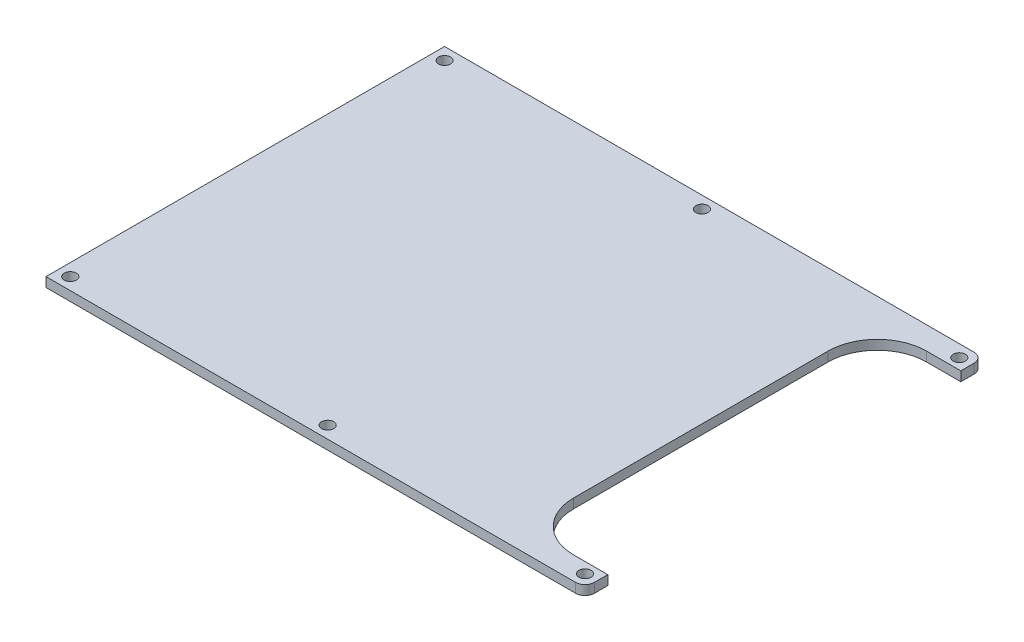
ISO-10303-21;
HEADER;
FILE_DESCRIPTION(('STEP AP214'),'2;1');
FILE_NAME('part.step','',(''),(''),'','','');
FILE_SCHEMA(('AUTOMOTIVE_DESIGN { 1 0 10303 214 1 1 1 1 }'));
ENDSEC;
DATA;
#1=APPLICATION_CONTEXT('core data for automotive mechanical design processes');
#2=APPLICATION_PROTOCOL_DEFINITION('international standard','automotive_design',2000,#1);
#3=PRODUCT_CONTEXT('',#1,'mechanical');
#4=PRODUCT('Part','Part','',(#3));
#5=PRODUCT_RELATED_PRODUCT_CATEGORY('part','',(#4));
#6=PRODUCT_DEFINITION_FORMATION('','',#4);
#7=PRODUCT_DEFINITION_CONTEXT('part definition',#1,'design');
#8=PRODUCT_DEFINITION('design','',#6,#7);
#9=PRODUCT_DEFINITION_SHAPE('','',#8);
#10=(LENGTH_UNIT() NAMED_UNIT(*) SI_UNIT(.MILLI.,.METRE.));
#11=(NAMED_UNIT(*) PLANE_ANGLE_UNIT() SI_UNIT($,.RADIAN.));
#12=(NAMED_UNIT(*) SI_UNIT($,.STERADIAN.) SOLID_ANGLE_UNIT());
#13=UNCERTAINTY_MEASURE_WITH_UNIT(LENGTH_MEASURE(1.E-05),#10,'distance_accuracy_value','');
#14=(GEOMETRIC_REPRESENTATION_CONTEXT(3) GLOBAL_UNCERTAINTY_ASSIGNED_CONTEXT((#13)) GLOBAL_UNIT_ASSIGNED_CONTEXT((#10,
#11,#12)) REPRESENTATION_CONTEXT('',''));
#15=CARTESIAN_POINT('',(0.,0.,0.));
#16=DIRECTION('',(0.,0.,1.));
#17=DIRECTION('',(1.,0.,0.));
#18=AXIS2_PLACEMENT_3D('',#15,#16,#17);
#19=CARTESIAN_POINT('',(71.,2.5,52.5));
#20=DIRECTION('',(-1.,0.,0.));
#21=DIRECTION('',(0.,0.,1.));
#22=AXIS2_PLACEMENT_3D('',#19,#20,#21);
#23=PLANE('',#22);
#24=DIRECTION('',(0.,0.,-1.));
#25=VECTOR('',#24,1.);
#26=CARTESIAN_POINT('',(71.,2.5,52.5));
#27=LINE('',#26,#25);
#28=CARTESIAN_POINT('',(71.,2.5,50.));
#29=VERTEX_POINT('',#28);
#30=CARTESIAN_POINT('',(71.,2.5,46.5));
#31=VERTEX_POINT('',#30);
#32=EDGE_CURVE('E184',#29,#31,#27,.T.);
#33=ORIENTED_EDGE('',*,*,#32,.F.);
#34=DIRECTION('',(0.,-1.,0.));
#35=VECTOR('',#34,1.);
#36=CARTESIAN_POINT('',(71.,2.5,50.));
#37=LINE('',#36,#35);
#38=CARTESIAN_POINT('',(71.,0.,50.));
#39=VERTEX_POINT('',#38);
#40=EDGE_CURVE('E41',#29,#39,#37,.T.);
#41=ORIENTED_EDGE('',*,*,#40,.T.);
#42=DIRECTION('',(0.,0.,-1.));
#43=VECTOR('',#42,1.);
#44=CARTESIAN_POINT('',(71.,0.,52.5));
#45=LINE('',#44,#43);
#46=CARTESIAN_POINT('',(71.,0.,46.5));
#47=VERTEX_POINT('',#46);
#48=EDGE_CURVE('E123',#39,#47,#45,.T.);
#49=ORIENTED_EDGE('',*,*,#48,.T.);
#50=DIRECTION('',(0.,1.,0.));
#51=VECTOR('',#50,1.);
#52=CARTESIAN_POINT('',(71.,-0.00100000000000013,46.5));
#53=LINE('',#52,#51);
#54=EDGE_CURVE('E126',#47,#31,#53,.T.);
#55=ORIENTED_EDGE('',*,*,#54,.T.);
#56=EDGE_LOOP('',(#33,#41,#49,#55));
#57=FACE_BOUND('',#56,.T.);
#58=ADVANCED_FACE('F33',(#57),#23,.F.);
#59=CARTESIAN_POINT('',(71.,0.,-46.5));
#60=VERTEX_POINT('',#59);
#61=CARTESIAN_POINT('',(71.,0.,-50.));
#62=VERTEX_POINT('',#61);
#63=EDGE_CURVE('E130',#60,#62,#45,.T.);
#64=ORIENTED_EDGE('',*,*,#63,.T.);
#65=DIRECTION('',(0.,-1.,0.));
#66=VECTOR('',#65,1.);
#67=CARTESIAN_POINT('',(71.,2.5,-50.));
#68=LINE('',#67,#66);
#69=CARTESIAN_POINT('',(71.,2.5,-50.));
#70=VERTEX_POINT('',#69);
#71=EDGE_CURVE('E227',#62,#70,#68,.F.);
#72=ORIENTED_EDGE('',*,*,#71,.T.);
#73=CARTESIAN_POINT('',(71.,2.5,-46.5));
#74=VERTEX_POINT('',#73);
#75=EDGE_CURVE('E187',#74,#70,#27,.T.);
#76=ORIENTED_EDGE('',*,*,#75,.F.);
#77=DIRECTION('',(0.,1.,0.));
#78=VECTOR('',#77,1.);
#79=CARTESIAN_POINT('',(71.,-0.00100000000000013,-46.5));
#80=LINE('',#79,#78);
#81=EDGE_CURVE('E151',#60,#74,#80,.T.);
#82=ORIENTED_EDGE('',*,*,#81,.F.);
#83=EDGE_LOOP('',(#64,#72,#76,#82));
#84=FACE_BOUND('',#83,.T.);
#85=ADVANCED_FACE('F250',(#84),#23,.F.);
#86=CARTESIAN_POINT('',(-71.,2.5,-52.5));
#87=DIRECTION('',(0.,0.,1.));
#88=DIRECTION('',(1.,0.,0.));
#89=AXIS2_PLACEMENT_3D('',#86,#87,#88);
#90=PLANE('',#89);
#91=DIRECTION('',(-1.,0.,0.));
#92=VECTOR('',#91,1.);
#93=CARTESIAN_POINT('',(-71.,2.5,-52.5));
#94=LINE('',#93,#92);
#95=CARTESIAN_POINT('',(68.5,2.5,-52.5));
#96=VERTEX_POINT('',#95);
#97=CARTESIAN_POINT('',(-71.,2.5,-52.5));
#98=VERTEX_POINT('',#97);
#99=EDGE_CURVE('E186',#96,#98,#94,.T.);
#100=ORIENTED_EDGE('',*,*,#99,.F.);
#101=DIRECTION('',(0.,-1.,0.));
#102=VECTOR('',#101,1.);
#103=CARTESIAN_POINT('',(68.5,2.5,-52.5));
#104=LINE('',#103,#102);
#105=CARTESIAN_POINT('',(68.5,0.,-52.5));
#106=VERTEX_POINT('',#105);
#107=EDGE_CURVE('E220',#96,#106,#104,.T.);
#108=ORIENTED_EDGE('',*,*,#107,.T.);
#109=DIRECTION('',(-1.,0.,0.));
#110=VECTOR('',#109,1.);
#111=CARTESIAN_POINT('',(-71.,0.,-52.5));
#112=LINE('',#111,#110);
#113=CARTESIAN_POINT('',(-71.,0.,-52.5));
#114=VERTEX_POINT('',#113);
#115=EDGE_CURVE('E129',#106,#114,#112,.T.);
#116=ORIENTED_EDGE('',*,*,#115,.T.);
#117=DIRECTION('',(0.,-1.,0.));
#118=VECTOR('',#117,1.);
#119=CARTESIAN_POINT('',(-71.,2.5,-52.5));
#120=LINE('',#119,#118);
#121=EDGE_CURVE('E201',#98,#114,#120,.T.);
#122=ORIENTED_EDGE('',*,*,#121,.F.);
#123=EDGE_LOOP('',(#100,#108,#116,#122));
#124=FACE_BOUND('',#123,.T.);
#125=ADVANCED_FACE('F242',(#124),#90,.F.);
#126=CARTESIAN_POINT('',(-71.,2.5,52.5));
#127=DIRECTION('',(1.,0.,0.));
#128=DIRECTION('',(0.,0.,-1.));
#129=AXIS2_PLACEMENT_3D('',#126,#127,#128);
#130=PLANE('',#129);
#131=DIRECTION('',(0.,0.,1.));
#132=VECTOR('',#131,1.);
#133=CARTESIAN_POINT('',(-71.,0.,52.5));
#134=LINE('',#133,#132);
#135=CARTESIAN_POINT('',(-71.,0.,52.5));
#136=VERTEX_POINT('',#135);
#137=EDGE_CURVE('E195',#114,#136,#134,.T.);
#138=ORIENTED_EDGE('',*,*,#137,.T.);
#139=DIRECTION('',(0.,-1.,0.));
#140=VECTOR('',#139,1.);
#141=CARTESIAN_POINT('',(-71.,2.5,52.5));
#142=LINE('',#141,#140);
#143=CARTESIAN_POINT('',(-71.,2.5,52.5));
#144=VERTEX_POINT('',#143);
#145=EDGE_CURVE('E192',#144,#136,#142,.T.);
#146=ORIENTED_EDGE('',*,*,#145,.F.);
#147=DIRECTION('',(0.,0.,1.));
#148=VECTOR('',#147,1.);
#149=CARTESIAN_POINT('',(-71.,2.5,52.5));
#150=LINE('',#149,#148);
#151=EDGE_CURVE('E189',#98,#144,#150,.T.);
#152=ORIENTED_EDGE('',*,*,#151,.F.);
#153=ORIENTED_EDGE('',*,*,#121,.T.);
#154=EDGE_LOOP('',(#138,#146,#152,#153));
#155=FACE_BOUND('',#154,.T.);
#156=ADVANCED_FACE('F323',(#155),#130,.F.);
#157=CARTESIAN_POINT('',(-71.,2.5,52.5));
#158=DIRECTION('',(0.,0.,-1.));
#159=DIRECTION('',(-1.,0.,0.));
#160=AXIS2_PLACEMENT_3D('',#157,#158,#159);
#161=PLANE('',#160);
#162=DIRECTION('',(1.,0.,0.));
#163=VECTOR('',#162,1.);
#164=CARTESIAN_POINT('',(-71.,0.,52.5));
#165=LINE('',#164,#163);
#166=CARTESIAN_POINT('',(68.5,0.,52.5));
#167=VERTEX_POINT('',#166);
#168=EDGE_CURVE('E197',#136,#167,#165,.T.);
#169=ORIENTED_EDGE('',*,*,#168,.T.);
#170=DIRECTION('',(0.,-1.,0.));
#171=VECTOR('',#170,1.);
#172=CARTESIAN_POINT('',(68.5,2.5,52.5));
#173=LINE('',#172,#171);
#174=CARTESIAN_POINT('',(68.5,2.5,52.5));
#175=VERTEX_POINT('',#174);
#176=EDGE_CURVE('E11',#167,#175,#173,.F.);
#177=ORIENTED_EDGE('',*,*,#176,.T.);
#178=DIRECTION('',(1.,0.,0.));
#179=VECTOR('',#178,1.);
#180=CARTESIAN_POINT('',(-71.,2.5,52.5));
#181=LINE('',#180,#179);
#182=EDGE_CURVE('E191',#144,#175,#181,.T.);
#183=ORIENTED_EDGE('',*,*,#182,.F.);
#184=ORIENTED_EDGE('',*,*,#145,.T.);
#185=EDGE_LOOP('',(#169,#177,#183,#184));
#186=FACE_BOUND('',#185,.T.);
#187=ADVANCED_FACE('F277',(#186),#161,.F.);
#188=CARTESIAN_POINT('',(0.,2.5,0.));
#189=DIRECTION('',(0.,-1.,0.));
#190=DIRECTION('',(0.,0.,-1.));
#191=AXIS2_PLACEMENT_3D('',#188,#189,#190);
#192=PLANE('',#191);
#193=CARTESIAN_POINT('',(0.,2.5,-49.3));
#194=DIRECTION('',(0.,1.,0.));
#195=DIRECTION('',(0.,0.,1.));
#196=AXIS2_PLACEMENT_3D('',#193,#194,#195);
#197=CIRCLE('',#196,1.6);
#198=CARTESIAN_POINT('',(0.,2.5,-47.7));
#199=VERTEX_POINT('',#198);
#200=EDGE_CURVE('E160',#199,#199,#197,.T.);
#201=ORIENTED_EDGE('',*,*,#200,.F.);
#202=EDGE_LOOP('',(#201));
#203=FACE_BOUND('',#202,.T.);
#204=CARTESIAN_POINT('',(0.,2.5,49.3));
#205=DIRECTION('',(0.,1.,0.));
#206=DIRECTION('',(0.,0.,1.));
#207=AXIS2_PLACEMENT_3D('',#204,#205,#206);
#208=CIRCLE('',#207,1.6);
#209=CARTESIAN_POINT('',(0.,2.5,50.9));
#210=VERTEX_POINT('',#209);
#211=EDGE_CURVE('E166',#210,#210,#208,.T.);
#212=ORIENTED_EDGE('',*,*,#211,.F.);
#213=EDGE_LOOP('',(#212));
#214=FACE_BOUND('',#213,.T.);
#215=CARTESIAN_POINT('',(-67.8,2.5,49.3));
#216=DIRECTION('',(0.,1.,0.));
#217=DIRECTION('',(0.,0.,1.));
#218=AXIS2_PLACEMENT_3D('',#215,#216,#217);
#219=CIRCLE('',#218,1.60000000000001);
#220=CARTESIAN_POINT('',(-67.8,2.5,50.9));
#221=VERTEX_POINT('',#220);
#222=EDGE_CURVE('E172',#221,#221,#219,.T.);
#223=ORIENTED_EDGE('',*,*,#222,.F.);
#224=EDGE_LOOP('',(#223));
#225=FACE_BOUND('',#224,.T.);
#226=CARTESIAN_POINT('',(67.8,2.5,-49.3));
#227=DIRECTION('',(0.,1.,0.));
#228=DIRECTION('',(0.,0.,1.));
#229=AXIS2_PLACEMENT_3D('',#226,#227,#228);
#230=CIRCLE('',#229,1.60000000000001);
#231=CARTESIAN_POINT('',(67.8,2.5,-47.7));
#232=VERTEX_POINT('',#231);
#233=EDGE_CURVE('E178',#232,#232,#230,.T.);
#234=ORIENTED_EDGE('',*,*,#233,.F.);
#235=EDGE_LOOP('',(#234));
#236=FACE_BOUND('',#235,.T.);
#237=CARTESIAN_POINT('',(67.8,2.5,49.3));
#238=DIRECTION('',(0.,1.,0.));
#239=DIRECTION('',(0.,0.,1.));
#240=AXIS2_PLACEMENT_3D('',#237,#238,#239);
#241=CIRCLE('',#240,1.60000000000001);
#242=CARTESIAN_POINT('',(67.8,2.5,50.9));
#243=VERTEX_POINT('',#242);
#244=EDGE_CURVE('E264',#243,#243,#241,.T.);
#245=ORIENTED_EDGE('',*,*,#244,.F.);
#246=EDGE_LOOP('',(#245));
#247=FACE_BOUND('',#246,.T.);
#248=CARTESIAN_POINT('',(-67.8,2.5,-49.3));
#249=DIRECTION('',(0.,1.,0.));
#250=DIRECTION('',(0.,0.,1.));
#251=AXIS2_PLACEMENT_3D('',#248,#249,#250);
#252=CIRCLE('',#251,1.60000000000001);
#253=CARTESIAN_POINT('',(-67.8,2.5,-47.7));
#254=VERTEX_POINT('',#253);
#255=EDGE_CURVE('E179',#254,#254,#252,.T.);
#256=ORIENTED_EDGE('',*,*,#255,.F.);
#257=EDGE_LOOP('',(#256));
#258=FACE_BOUND('',#257,.T.);
#259=ORIENTED_EDGE('',*,*,#75,.T.);
#260=CARTESIAN_POINT('',(68.5,2.5,-50.));
#261=DIRECTION('',(0.,-1.,0.));
#262=DIRECTION('',(0.,0.,-1.));
#263=AXIS2_PLACEMENT_3D('',#260,#261,#262);
#264=CIRCLE('',#263,2.5);
#265=EDGE_CURVE('E230',#70,#96,#264,.F.);
#266=ORIENTED_EDGE('',*,*,#265,.T.);
#267=ORIENTED_EDGE('',*,*,#99,.T.);
#268=ORIENTED_EDGE('',*,*,#151,.T.);
#269=ORIENTED_EDGE('',*,*,#182,.T.);
#270=CARTESIAN_POINT('',(68.5,2.5,50.));
#271=DIRECTION('',(0.,-1.,0.));
#272=DIRECTION('',(0.,0.,-1.));
#273=AXIS2_PLACEMENT_3D('',#270,#271,#272);
#274=CIRCLE('',#273,2.5);
#275=EDGE_CURVE('E53',#175,#29,#274,.F.);
#276=ORIENTED_EDGE('',*,*,#275,.T.);
#277=ORIENTED_EDGE('',*,*,#32,.T.);
#278=DIRECTION('',(1.,0.,0.));
#279=VECTOR('',#278,1.);
#280=CARTESIAN_POINT('',(71.,2.5,46.5));
#281=LINE('',#280,#279);
#282=CARTESIAN_POINT('',(62.,2.5,46.5));
#283=VERTEX_POINT('',#282);
#284=EDGE_CURVE('E149',#283,#31,#281,.T.);
#285=ORIENTED_EDGE('',*,*,#284,.F.);
#286=CARTESIAN_POINT('',(62.,2.5,33.5));
#287=DIRECTION('',(0.,-1.,0.));
#288=DIRECTION('',(0.,0.,-1.));
#289=AXIS2_PLACEMENT_3D('',#286,#287,#288);
#290=CIRCLE('',#289,13.);
#291=CARTESIAN_POINT('',(49.,2.5,33.5));
#292=VERTEX_POINT('',#291);
#293=EDGE_CURVE('E213',#283,#292,#290,.T.);
#294=ORIENTED_EDGE('',*,*,#293,.T.);
#295=DIRECTION('',(0.,0.,1.));
#296=VECTOR('',#295,1.);
#297=CARTESIAN_POINT('',(49.,2.5,-46.5));
#298=LINE('',#297,#296);
#299=CARTESIAN_POINT('',(49.,2.5,-33.5));
#300=VERTEX_POINT('',#299);
#301=EDGE_CURVE('E256',#300,#292,#298,.T.);
#302=ORIENTED_EDGE('',*,*,#301,.F.);
#303=CARTESIAN_POINT('',(62.,2.5,-33.5));
#304=DIRECTION('',(0.,-1.,0.));
#305=DIRECTION('',(0.,0.,-1.));
#306=AXIS2_PLACEMENT_3D('',#303,#304,#305);
#307=CIRCLE('',#306,13.);
#308=CARTESIAN_POINT('',(62.,2.5,-46.5));
#309=VERTEX_POINT('',#308);
#310=EDGE_CURVE('E216',#300,#309,#307,.T.);
#311=ORIENTED_EDGE('',*,*,#310,.T.);
#312=DIRECTION('',(-1.,0.,0.));
#313=VECTOR('',#312,1.);
#314=CARTESIAN_POINT('',(71.,2.5,-46.5));
#315=LINE('',#314,#313);
#316=EDGE_CURVE('E143',#74,#309,#315,.T.);
#317=ORIENTED_EDGE('',*,*,#316,.F.);
#318=EDGE_LOOP('',(#259,#266,#267,#268,#269,#276,#277,#285,#294,#302,#311,#317));
#319=FACE_BOUND('',#318,.T.);
#320=ADVANCED_FACE('F234',(#203,#214,#225,#236,#247,#258,#319),#192,.F.);
#321=CARTESIAN_POINT('',(0.,0.,0.));
#322=DIRECTION('',(0.,-1.,0.));
#323=DIRECTION('',(0.,0.,-1.));
#324=AXIS2_PLACEMENT_3D('',#321,#322,#323);
#325=PLANE('',#324);
#326=ORIENTED_EDGE('',*,*,#115,.F.);
#327=CARTESIAN_POINT('',(68.5,0.,-50.));
#328=DIRECTION('',(0.,-1.,0.));
#329=DIRECTION('',(0.,0.,-1.));
#330=AXIS2_PLACEMENT_3D('',#327,#328,#329);
#331=CIRCLE('',#330,2.5);
#332=EDGE_CURVE('E225',#106,#62,#331,.T.);
#333=ORIENTED_EDGE('',*,*,#332,.T.);
#334=ORIENTED_EDGE('',*,*,#63,.F.);
#335=DIRECTION('',(-1.,0.,0.));
#336=VECTOR('',#335,1.);
#337=CARTESIAN_POINT('',(71.,0.,-46.5));
#338=LINE('',#337,#336);
#339=CARTESIAN_POINT('',(62.,0.,-46.5));
#340=VERTEX_POINT('',#339);
#341=EDGE_CURVE('E150',#60,#340,#338,.T.);
#342=ORIENTED_EDGE('',*,*,#341,.T.);
#343=CARTESIAN_POINT('',(62.,0.,-33.5));
#344=DIRECTION('',(0.,-1.,0.));
#345=DIRECTION('',(0.,0.,-1.));
#346=AXIS2_PLACEMENT_3D('',#343,#344,#345);
#347=CIRCLE('',#346,13.);
#348=CARTESIAN_POINT('',(49.,0.,-33.5));
#349=VERTEX_POINT('',#348);
#350=EDGE_CURVE('E218',#340,#349,#347,.F.);
#351=ORIENTED_EDGE('',*,*,#350,.T.);
#352=DIRECTION('',(0.,0.,1.));
#353=VECTOR('',#352,1.);
#354=CARTESIAN_POINT('',(49.,0.,-46.5));
#355=LINE('',#354,#353);
#356=CARTESIAN_POINT('',(49.,0.,33.5));
#357=VERTEX_POINT('',#356);
#358=EDGE_CURVE('E144',#349,#357,#355,.T.);
#359=ORIENTED_EDGE('',*,*,#358,.T.);
#360=CARTESIAN_POINT('',(62.,0.,33.5));
#361=DIRECTION('',(0.,-1.,0.));
#362=DIRECTION('',(0.,0.,-1.));
#363=AXIS2_PLACEMENT_3D('',#360,#361,#362);
#364=CIRCLE('',#363,13.);
#365=CARTESIAN_POINT('',(62.,0.,46.5));
#366=VERTEX_POINT('',#365);
#367=EDGE_CURVE('E139',#357,#366,#364,.F.);
#368=ORIENTED_EDGE('',*,*,#367,.T.);
#369=DIRECTION('',(1.,0.,0.));
#370=VECTOR('',#369,1.);
#371=CARTESIAN_POINT('',(71.,0.,46.5));
#372=LINE('',#371,#370);
#373=EDGE_CURVE('E133',#366,#47,#372,.T.);
#374=ORIENTED_EDGE('',*,*,#373,.T.);
#375=ORIENTED_EDGE('',*,*,#48,.F.);
#376=CARTESIAN_POINT('',(68.5,0.,50.));
#377=DIRECTION('',(0.,-1.,0.));
#378=DIRECTION('',(0.,0.,-1.));
#379=AXIS2_PLACEMENT_3D('',#376,#377,#378);
#380=CIRCLE('',#379,2.5);
#381=EDGE_CURVE('E223',#39,#167,#380,.T.);
#382=ORIENTED_EDGE('',*,*,#381,.T.);
#383=ORIENTED_EDGE('',*,*,#168,.F.);
#384=ORIENTED_EDGE('',*,*,#137,.F.);
#385=EDGE_LOOP('',(#326,#333,#334,#342,#351,#359,#368,#374,#375,#382,#383,#384));
#386=FACE_BOUND('',#385,.T.);
#387=CARTESIAN_POINT('',(0.,0.,-49.3));
#388=DIRECTION('',(0.,-1.,0.));
#389=DIRECTION('',(0.,0.,-1.));
#390=AXIS2_PLACEMENT_3D('',#387,#388,#389);
#391=CIRCLE('',#390,1.6);
#392=CARTESIAN_POINT('',(0.,0.,-50.9));
#393=VERTEX_POINT('',#392);
#394=EDGE_CURVE('E163',#393,#393,#391,.F.);
#395=ORIENTED_EDGE('',*,*,#394,.T.);
#396=EDGE_LOOP('',(#395));
#397=FACE_BOUND('',#396,.T.);
#398=CARTESIAN_POINT('',(0.,0.,49.3));
#399=DIRECTION('',(0.,-1.,0.));
#400=DIRECTION('',(0.,0.,-1.));
#401=AXIS2_PLACEMENT_3D('',#398,#399,#400);
#402=CIRCLE('',#401,1.6);
#403=CARTESIAN_POINT('',(0.,0.,47.7));
#404=VERTEX_POINT('',#403);
#405=EDGE_CURVE('E169',#404,#404,#402,.F.);
#406=ORIENTED_EDGE('',*,*,#405,.T.);
#407=EDGE_LOOP('',(#406));
#408=FACE_BOUND('',#407,.T.);
#409=CARTESIAN_POINT('',(-67.8,0.,49.3));
#410=DIRECTION('',(0.,-1.,0.));
#411=DIRECTION('',(0.,0.,-1.));
#412=AXIS2_PLACEMENT_3D('',#409,#410,#411);
#413=CIRCLE('',#412,1.60000000000001);
#414=CARTESIAN_POINT('',(-67.8,0.,47.7));
#415=VERTEX_POINT('',#414);
#416=EDGE_CURVE('E175',#415,#415,#413,.F.);
#417=ORIENTED_EDGE('',*,*,#416,.T.);
#418=EDGE_LOOP('',(#417));
#419=FACE_BOUND('',#418,.T.);
#420=CARTESIAN_POINT('',(67.8,0.,-49.3));
#421=DIRECTION('',(0.,-1.,0.));
#422=DIRECTION('',(0.,0.,-1.));
#423=AXIS2_PLACEMENT_3D('',#420,#421,#422);
#424=CIRCLE('',#423,1.60000000000001);
#425=CARTESIAN_POINT('',(67.8,0.,-50.9));
#426=VERTEX_POINT('',#425);
#427=EDGE_CURVE('E267',#426,#426,#424,.F.);
#428=ORIENTED_EDGE('',*,*,#427,.T.);
#429=EDGE_LOOP('',(#428));
#430=FACE_BOUND('',#429,.T.);
#431=CARTESIAN_POINT('',(67.8,0.,49.3));
#432=DIRECTION('',(0.,-1.,0.));
#433=DIRECTION('',(0.,0.,-1.));
#434=AXIS2_PLACEMENT_3D('',#431,#432,#433);
#435=CIRCLE('',#434,1.60000000000001);
#436=CARTESIAN_POINT('',(67.8,0.,47.7));
#437=VERTEX_POINT('',#436);
#438=EDGE_CURVE('E261',#437,#437,#435,.F.);
#439=ORIENTED_EDGE('',*,*,#438,.T.);
#440=EDGE_LOOP('',(#439));
#441=FACE_BOUND('',#440,.T.);
#442=CARTESIAN_POINT('',(-67.8,0.,-49.3));
#443=DIRECTION('',(0.,-1.,0.));
#444=DIRECTION('',(0.,0.,-1.));
#445=AXIS2_PLACEMENT_3D('',#442,#443,#444);
#446=CIRCLE('',#445,1.60000000000001);
#447=CARTESIAN_POINT('',(-67.8,0.,-50.9));
#448=VERTEX_POINT('',#447);
#449=EDGE_CURVE('E154',#448,#448,#446,.F.);
#450=ORIENTED_EDGE('',*,*,#449,.T.);
#451=EDGE_LOOP('',(#450));
#452=FACE_BOUND('',#451,.T.);
#453=ADVANCED_FACE('F135',(#386,#397,#408,#419,#430,#441,#452),#325,.T.);
#454=CARTESIAN_POINT('',(-67.8,-0.00100000000000013,-49.3));
#455=DIRECTION('',(0.,1.,0.));
#456=DIRECTION('',(0.,0.,1.));
#457=AXIS2_PLACEMENT_3D('',#454,#455,#456);
#458=CYLINDRICAL_SURFACE('',#457,1.60000000000001);
#459=ORIENTED_EDGE('',*,*,#449,.F.);
#460=EDGE_LOOP('',(#459));
#461=FACE_BOUND('',#460,.T.);
#462=ORIENTED_EDGE('',*,*,#255,.T.);
#463=EDGE_LOOP('',(#462));
#464=FACE_BOUND('',#463,.T.);
#465=ADVANCED_FACE('F284',(#461,#464),#458,.F.);
#466=CARTESIAN_POINT('',(67.8,-0.00100000000000013,49.3));
#467=DIRECTION('',(0.,1.,0.));
#468=DIRECTION('',(0.,0.,1.));
#469=AXIS2_PLACEMENT_3D('',#466,#467,#468);
#470=CYLINDRICAL_SURFACE('',#469,1.60000000000001);
#471=ORIENTED_EDGE('',*,*,#438,.F.);
#472=EDGE_LOOP('',(#471));
#473=FACE_BOUND('',#472,.T.);
#474=ORIENTED_EDGE('',*,*,#244,.T.);
#475=EDGE_LOOP('',(#474));
#476=FACE_BOUND('',#475,.T.);
#477=ADVANCED_FACE('F286',(#473,#476),#470,.F.);
#478=CARTESIAN_POINT('',(67.8,-0.00100000000000013,-49.3));
#479=DIRECTION('',(0.,1.,0.));
#480=DIRECTION('',(0.,0.,1.));
#481=AXIS2_PLACEMENT_3D('',#478,#479,#480);
#482=CYLINDRICAL_SURFACE('',#481,1.60000000000001);
#483=ORIENTED_EDGE('',*,*,#427,.F.);
#484=EDGE_LOOP('',(#483));
#485=FACE_BOUND('',#484,.T.);
#486=ORIENTED_EDGE('',*,*,#233,.T.);
#487=EDGE_LOOP('',(#486));
#488=FACE_BOUND('',#487,.T.);
#489=ADVANCED_FACE('F273',(#485,#488),#482,.F.);
#490=CARTESIAN_POINT('',(-67.8,-0.00100000000000013,49.3));
#491=DIRECTION('',(0.,1.,0.));
#492=DIRECTION('',(0.,0.,1.));
#493=AXIS2_PLACEMENT_3D('',#490,#491,#492);
#494=CYLINDRICAL_SURFACE('',#493,1.60000000000001);
#495=ORIENTED_EDGE('',*,*,#416,.F.);
#496=EDGE_LOOP('',(#495));
#497=FACE_BOUND('',#496,.T.);
#498=ORIENTED_EDGE('',*,*,#222,.T.);
#499=EDGE_LOOP('',(#498));
#500=FACE_BOUND('',#499,.T.);
#501=ADVANCED_FACE('F402',(#497,#500),#494,.F.);
#502=CARTESIAN_POINT('',(0.,-0.00100000000000013,49.3));
#503=DIRECTION('',(0.,1.,0.));
#504=DIRECTION('',(0.,0.,1.));
#505=AXIS2_PLACEMENT_3D('',#502,#503,#504);
#506=CYLINDRICAL_SURFACE('',#505,1.6);
#507=ORIENTED_EDGE('',*,*,#405,.F.);
#508=EDGE_LOOP('',(#507));
#509=FACE_BOUND('',#508,.T.);
#510=ORIENTED_EDGE('',*,*,#211,.T.);
#511=EDGE_LOOP('',(#510));
#512=FACE_BOUND('',#511,.T.);
#513=ADVANCED_FACE('F392',(#509,#512),#506,.F.);
#514=CARTESIAN_POINT('',(0.,-0.00100000000000013,-49.3));
#515=DIRECTION('',(0.,1.,0.));
#516=DIRECTION('',(0.,0.,1.));
#517=AXIS2_PLACEMENT_3D('',#514,#515,#516);
#518=CYLINDRICAL_SURFACE('',#517,1.6);
#519=ORIENTED_EDGE('',*,*,#394,.F.);
#520=EDGE_LOOP('',(#519));
#521=FACE_BOUND('',#520,.T.);
#522=ORIENTED_EDGE('',*,*,#200,.T.);
#523=EDGE_LOOP('',(#522));
#524=FACE_BOUND('',#523,.T.);
#525=ADVANCED_FACE('F383',(#521,#524),#518,.F.);
#526=CARTESIAN_POINT('',(71.,-0.00100000000000013,46.5));
#527=DIRECTION('',(0.,0.,1.));
#528=DIRECTION('',(1.,0.,0.));
#529=AXIS2_PLACEMENT_3D('',#526,#527,#528);
#530=PLANE('',#529);
#531=ORIENTED_EDGE('',*,*,#373,.F.);
#532=DIRECTION('',(0.,1.,0.));
#533=VECTOR('',#532,1.);
#534=CARTESIAN_POINT('',(62.,2.5,46.5));
#535=LINE('',#534,#533);
#536=EDGE_CURVE('E204',#366,#283,#535,.T.);
#537=ORIENTED_EDGE('',*,*,#536,.T.);
#538=ORIENTED_EDGE('',*,*,#284,.T.);
#539=ORIENTED_EDGE('',*,*,#54,.F.);
#540=EDGE_LOOP('',(#531,#537,#538,#539));
#541=FACE_BOUND('',#540,.T.);
#542=ADVANCED_FACE('F147',(#541),#530,.F.);
#543=CARTESIAN_POINT('',(49.,-0.00100000000000013,-46.5));
#544=DIRECTION('',(-1.,0.,0.));
#545=DIRECTION('',(0.,0.,1.));
#546=AXIS2_PLACEMENT_3D('',#543,#544,#545);
#547=PLANE('',#546);
#548=ORIENTED_EDGE('',*,*,#301,.T.);
#549=DIRECTION('',(0.,1.,0.));
#550=VECTOR('',#549,1.);
#551=CARTESIAN_POINT('',(49.,0.,33.5));
#552=LINE('',#551,#550);
#553=EDGE_CURVE('E209',#292,#357,#552,.F.);
#554=ORIENTED_EDGE('',*,*,#553,.T.);
#555=ORIENTED_EDGE('',*,*,#358,.F.);
#556=DIRECTION('',(0.,1.,0.));
#557=VECTOR('',#556,1.);
#558=CARTESIAN_POINT('',(49.,2.5,-33.5));
#559=LINE('',#558,#557);
#560=EDGE_CURVE('E206',#349,#300,#559,.T.);
#561=ORIENTED_EDGE('',*,*,#560,.T.);
#562=EDGE_LOOP('',(#548,#554,#555,#561));
#563=FACE_BOUND('',#562,.T.);
#564=ADVANCED_FACE('F365',(#563),#547,.F.);
#565=CARTESIAN_POINT('',(71.,-0.00100000000000013,-46.5));
#566=DIRECTION('',(0.,0.,-1.));
#567=DIRECTION('',(-1.,0.,0.));
#568=AXIS2_PLACEMENT_3D('',#565,#566,#567);
#569=PLANE('',#568);
#570=ORIENTED_EDGE('',*,*,#316,.T.);
#571=DIRECTION('',(0.,1.,0.));
#572=VECTOR('',#571,1.);
#573=CARTESIAN_POINT('',(62.,0.,-46.5));
#574=LINE('',#573,#572);
#575=EDGE_CURVE('E211',#309,#340,#574,.F.);
#576=ORIENTED_EDGE('',*,*,#575,.T.);
#577=ORIENTED_EDGE('',*,*,#341,.F.);
#578=ORIENTED_EDGE('',*,*,#81,.T.);
#579=EDGE_LOOP('',(#570,#576,#577,#578));
#580=FACE_BOUND('',#579,.T.);
#581=ADVANCED_FACE('F253',(#580),#569,.F.);
#582=CARTESIAN_POINT('',(62.,-0.00100000000000013,33.5));
#583=DIRECTION('',(0.,-1.,0.));
#584=DIRECTION('',(0.,0.,-1.));
#585=AXIS2_PLACEMENT_3D('',#582,#583,#584);
#586=CYLINDRICAL_SURFACE('',#585,13.);
#587=ORIENTED_EDGE('',*,*,#367,.F.);
#588=ORIENTED_EDGE('',*,*,#553,.F.);
#589=ORIENTED_EDGE('',*,*,#293,.F.);
#590=ORIENTED_EDGE('',*,*,#536,.F.);
#591=EDGE_LOOP('',(#587,#588,#589,#590));
#592=FACE_BOUND('',#591,.T.);
#593=ADVANCED_FACE('F306',(#592),#586,.F.);
#594=CARTESIAN_POINT('',(62.,-0.00100000000000013,-33.5));
#595=DIRECTION('',(0.,-1.,0.));
#596=DIRECTION('',(0.,0.,-1.));
#597=AXIS2_PLACEMENT_3D('',#594,#595,#596);
#598=CYLINDRICAL_SURFACE('',#597,13.);
#599=ORIENTED_EDGE('',*,*,#350,.F.);
#600=ORIENTED_EDGE('',*,*,#575,.F.);
#601=ORIENTED_EDGE('',*,*,#310,.F.);
#602=ORIENTED_EDGE('',*,*,#560,.F.);
#603=EDGE_LOOP('',(#599,#600,#601,#602));
#604=FACE_BOUND('',#603,.T.);
#605=ADVANCED_FACE('F309',(#604),#598,.F.);
#606=CARTESIAN_POINT('',(68.5,2.5,-50.));
#607=DIRECTION('',(0.,-1.,0.));
#608=DIRECTION('',(0.,0.,-1.));
#609=AXIS2_PLACEMENT_3D('',#606,#607,#608);
#610=CYLINDRICAL_SURFACE('',#609,2.5);
#611=ORIENTED_EDGE('',*,*,#265,.F.);
#612=ORIENTED_EDGE('',*,*,#71,.F.);
#613=ORIENTED_EDGE('',*,*,#332,.F.);
#614=ORIENTED_EDGE('',*,*,#107,.F.);
#615=EDGE_LOOP('',(#611,#612,#613,#614));
#616=FACE_BOUND('',#615,.T.);
#617=ADVANCED_FACE('F244',(#616),#610,.T.);
#618=CARTESIAN_POINT('',(68.5,2.5,50.));
#619=DIRECTION('',(0.,-1.,0.));
#620=DIRECTION('',(0.,0.,-1.));
#621=AXIS2_PLACEMENT_3D('',#618,#619,#620);
#622=CYLINDRICAL_SURFACE('',#621,2.5);
#623=ORIENTED_EDGE('',*,*,#275,.F.);
#624=ORIENTED_EDGE('',*,*,#176,.F.);
#625=ORIENTED_EDGE('',*,*,#381,.F.);
#626=ORIENTED_EDGE('',*,*,#40,.F.);
#627=EDGE_LOOP('',(#623,#624,#625,#626));
#628=FACE_BOUND('',#627,.T.);
#629=ADVANCED_FACE('F35',(#628),#622,.T.);
#630=CLOSED_SHELL('',(#58,#85,#125,#156,#187,#320,#453,#465,#477,#489,#501,#513,#525,#542,#564,
#581,#593,#605,#617,#629));
#631=MANIFOLD_SOLID_BREP('B2',#630);
#632=ADVANCED_BREP_SHAPE_REPRESENTATION('',(#18,#631),#14);
#633=SHAPE_DEFINITION_REPRESENTATION(#9,#632);
ENDSEC;
END-ISO-10303-21;
